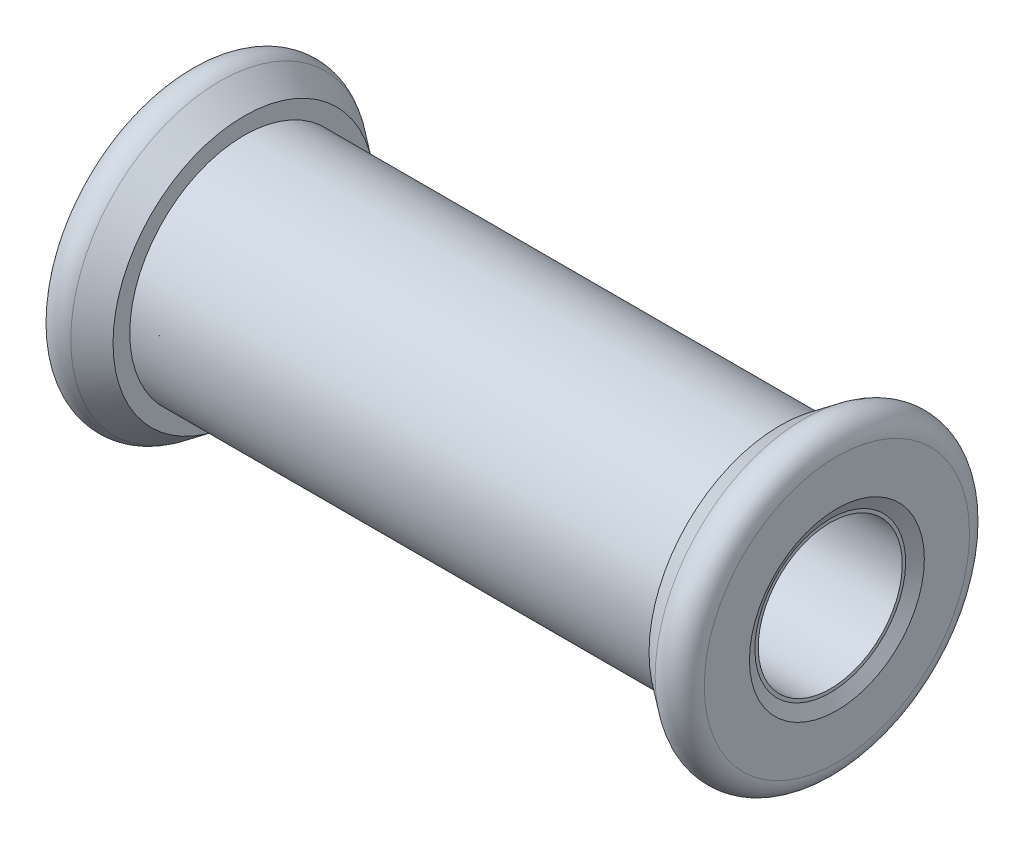
ISO-10303-21;
HEADER;
FILE_DESCRIPTION(('STEP AP214'),'2;1');
FILE_NAME('part.step','',(''),(''),'','','');
FILE_SCHEMA(('AUTOMOTIVE_DESIGN { 1 0 10303 214 1 1 1 1 }'));
ENDSEC;
DATA;
#1=APPLICATION_CONTEXT('core data for automotive mechanical design processes');
#2=APPLICATION_PROTOCOL_DEFINITION('international standard','automotive_design',2000,#1);
#3=PRODUCT_CONTEXT('',#1,'mechanical');
#4=PRODUCT('Part','Part','',(#3));
#5=PRODUCT_RELATED_PRODUCT_CATEGORY('part','',(#4));
#6=PRODUCT_DEFINITION_FORMATION('','',#4);
#7=PRODUCT_DEFINITION_CONTEXT('part definition',#1,'design');
#8=PRODUCT_DEFINITION('design','',#6,#7);
#9=PRODUCT_DEFINITION_SHAPE('','',#8);
#10=(LENGTH_UNIT() NAMED_UNIT(*) SI_UNIT(.MILLI.,.METRE.));
#11=(NAMED_UNIT(*) PLANE_ANGLE_UNIT() SI_UNIT($,.RADIAN.));
#12=(NAMED_UNIT(*) SI_UNIT($,.STERADIAN.) SOLID_ANGLE_UNIT());
#13=UNCERTAINTY_MEASURE_WITH_UNIT(LENGTH_MEASURE(1.E-05),#10,'distance_accuracy_value','');
#14=(GEOMETRIC_REPRESENTATION_CONTEXT(3) GLOBAL_UNCERTAINTY_ASSIGNED_CONTEXT((#13)) GLOBAL_UNIT_ASSIGNED_CONTEXT((#10,
#11,#12)) REPRESENTATION_CONTEXT('',''));
#15=CARTESIAN_POINT('',(0.,0.,0.));
#16=DIRECTION('',(0.,0.,1.));
#17=DIRECTION('',(1.,0.,0.));
#18=AXIS2_PLACEMENT_3D('',#15,#16,#17);
#19=CARTESIAN_POINT('',(-37.0450236506257,2.25,0.));
#20=DIRECTION('',(-1.,0.,0.));
#21=DIRECTION('',(0.,-1.,0.));
#22=AXIS2_PLACEMENT_3D('',#19,#20,#21);
#23=PLANE('',#22);
#24=CARTESIAN_POINT('',(-37.0450236506257,0.,0.));
#25=DIRECTION('',(-1.,0.,0.));
#26=DIRECTION('',(0.,-1.,0.));
#27=AXIS2_PLACEMENT_3D('',#24,#25,#26);
#28=CIRCLE('',#27,2.15);
#29=CARTESIAN_POINT('',(-37.0450236506257,-2.15000000000001,0.));
#30=VERTEX_POINT('',#29);
#31=EDGE_CURVE('E80',#30,#30,#28,.T.);
#32=ORIENTED_EDGE('',*,*,#31,.F.);
#33=EDGE_LOOP('',(#32));
#34=FACE_BOUND('',#33,.T.);
#35=CARTESIAN_POINT('',(-37.0450236506257,0.,0.));
#36=DIRECTION('',(1.,0.,0.));
#37=DIRECTION('',(0.,1.,0.));
#38=AXIS2_PLACEMENT_3D('',#35,#36,#37);
#39=CIRCLE('',#38,2.25);
#40=CARTESIAN_POINT('',(-37.0450236506257,2.25,0.));
#41=VERTEX_POINT('',#40);
#42=EDGE_CURVE('E10',#41,#41,#39,.T.);
#43=ORIENTED_EDGE('',*,*,#42,.F.);
#44=EDGE_LOOP('',(#43));
#45=FACE_BOUND('',#44,.T.);
#46=ADVANCED_FACE('F37',(#34,#45),#23,.T.);
#47=CARTESIAN_POINT('',(-37.2434719696285,0.,0.));
#48=DIRECTION('',(-1.,0.,0.));
#49=DIRECTION('',(0.,-1.,0.));
#50=AXIS2_PLACEMENT_3D('',#47,#48,#49);
#51=CONICAL_SURFACE('',#50,2.61038394250595,1.06744803558932);
#52=ORIENTED_EDGE('',*,*,#42,.T.);
#53=EDGE_LOOP('',(#52));
#54=FACE_BOUND('',#53,.T.);
#55=CARTESIAN_POINT('',(-37.2434719696285,0.,0.));
#56=DIRECTION('',(1.,0.,0.));
#57=DIRECTION('',(0.,1.,0.));
#58=AXIS2_PLACEMENT_3D('',#55,#56,#57);
#59=CIRCLE('',#58,2.61038394250595);
#60=CARTESIAN_POINT('',(-37.2434719696285,2.61038394250594,0.));
#61=VERTEX_POINT('',#60);
#62=EDGE_CURVE('E43',#61,#61,#59,.T.);
#63=ORIENTED_EDGE('',*,*,#62,.F.);
#64=EDGE_LOOP('',(#63));
#65=FACE_BOUND('',#64,.T.);
#66=ADVANCED_FACE('F107',(#54,#65),#51,.F.);
#67=CARTESIAN_POINT('',(-37.2434719696285,3.95960007812495,0.));
#68=DIRECTION('',(-1.,0.,0.));
#69=DIRECTION('',(0.,-1.,0.));
#70=AXIS2_PLACEMENT_3D('',#67,#68,#69);
#71=PLANE('',#70);
#72=ORIENTED_EDGE('',*,*,#62,.T.);
#73=EDGE_LOOP('',(#72));
#74=FACE_BOUND('',#73,.T.);
#75=CARTESIAN_POINT('',(-37.2434719696286,0.,0.));
#76=DIRECTION('',(1.,0.,0.));
#77=DIRECTION('',(0.,1.,0.));
#78=AXIS2_PLACEMENT_3D('',#75,#76,#77);
#79=CIRCLE('',#78,3.95960007812495);
#80=CARTESIAN_POINT('',(-37.2434719696286,3.95960007812495,0.));
#81=VERTEX_POINT('',#80);
#82=EDGE_CURVE('E47',#81,#81,#79,.T.);
#83=ORIENTED_EDGE('',*,*,#82,.F.);
#84=EDGE_LOOP('',(#83));
#85=FACE_BOUND('',#84,.T.);
#86=ADVANCED_FACE('F112',(#74,#85),#71,.T.);
#87=CARTESIAN_POINT('',(-36.632544393478,0.,0.));
#88=DIRECTION('',(1.,0.,0.));
#89=DIRECTION('',(0.,1.,0.));
#90=AXIS2_PLACEMENT_3D('',#87,#88,#89);
#91=TOROIDAL_SURFACE('',#90,3.95960007812495,0.610927576150531);
#92=ORIENTED_EDGE('',*,*,#82,.T.);
#93=EDGE_LOOP('',(#92));
#94=FACE_BOUND('',#93,.T.);
#95=CARTESIAN_POINT('',(-36.2670225791745,0.,0.));
#96=DIRECTION('',(1.,0.,0.));
#97=DIRECTION('',(0.,1.,0.));
#98=AXIS2_PLACEMENT_3D('',#95,#96,#97);
#99=CIRCLE('',#98,4.44911647884042);
#100=CARTESIAN_POINT('',(-36.2670225791745,4.44911647884041,0.));
#101=VERTEX_POINT('',#100);
#102=EDGE_CURVE('E51',#101,#101,#99,.T.);
#103=ORIENTED_EDGE('',*,*,#102,.F.);
#104=EDGE_LOOP('',(#103));
#105=FACE_BOUND('',#104,.T.);
#106=ADVANCED_FACE('F198',(#94,#105),#91,.T.);
#107=CARTESIAN_POINT('',(-35.5450236506257,0.,0.));
#108=DIRECTION('',(-1.,0.,0.));
#109=DIRECTION('',(0.,-1.,0.));
#110=AXIS2_PLACEMENT_3D('',#107,#108,#109);
#111=CONICAL_SURFACE('',#110,3.91000000000001,0.641385653539909);
#112=ORIENTED_EDGE('',*,*,#102,.T.);
#113=EDGE_LOOP('',(#112));
#114=FACE_BOUND('',#113,.T.);
#115=CARTESIAN_POINT('',(-35.5450236506257,0.,0.));
#116=DIRECTION('',(1.,0.,0.));
#117=DIRECTION('',(0.,1.,0.));
#118=AXIS2_PLACEMENT_3D('',#115,#116,#117);
#119=CIRCLE('',#118,3.91000000000001);
#120=CARTESIAN_POINT('',(-35.5450236506257,3.91,0.));
#121=VERTEX_POINT('',#120);
#122=EDGE_CURVE('E56',#121,#121,#119,.T.);
#123=ORIENTED_EDGE('',*,*,#122,.F.);
#124=EDGE_LOOP('',(#123));
#125=FACE_BOUND('',#124,.T.);
#126=ADVANCED_FACE('F188',(#114,#125),#111,.T.);
#127=CARTESIAN_POINT('',(-35.5450236506257,3.41,0.));
#128=DIRECTION('',(1.,0.,0.));
#129=DIRECTION('',(0.,1.,0.));
#130=AXIS2_PLACEMENT_3D('',#127,#128,#129);
#131=PLANE('',#130);
#132=ORIENTED_EDGE('',*,*,#122,.T.);
#133=EDGE_LOOP('',(#132));
#134=FACE_BOUND('',#133,.T.);
#135=CARTESIAN_POINT('',(-35.5450236506257,0.,0.));
#136=DIRECTION('',(1.,0.,0.));
#137=DIRECTION('',(0.,1.,0.));
#138=AXIS2_PLACEMENT_3D('',#135,#136,#137);
#139=CIRCLE('',#138,3.41);
#140=CARTESIAN_POINT('',(-35.5450236506257,3.41,0.));
#141=VERTEX_POINT('',#140);
#142=EDGE_CURVE('E59',#141,#141,#139,.T.);
#143=ORIENTED_EDGE('',*,*,#142,.F.);
#144=EDGE_LOOP('',(#143));
#145=FACE_BOUND('',#144,.T.);
#146=ADVANCED_FACE('F178',(#134,#145),#131,.T.);
#147=CARTESIAN_POINT('',(-9.25051990194016,0.,0.));
#148=DIRECTION('',(1.,0.,0.));
#149=DIRECTION('',(0.,1.,0.));
#150=AXIS2_PLACEMENT_3D('',#147,#148,#149);
#151=CYLINDRICAL_SURFACE('',#150,3.41);
#152=ORIENTED_EDGE('',*,*,#142,.T.);
#153=EDGE_LOOP('',(#152));
#154=FACE_BOUND('',#153,.T.);
#155=CARTESIAN_POINT('',(-19.5450236506257,0.,0.));
#156=DIRECTION('',(1.,0.,0.));
#157=DIRECTION('',(0.,1.,0.));
#158=AXIS2_PLACEMENT_3D('',#155,#156,#157);
#159=CIRCLE('',#158,3.41);
#160=CARTESIAN_POINT('',(-19.5450236506257,3.41,0.));
#161=VERTEX_POINT('',#160);
#162=EDGE_CURVE('E62',#161,#161,#159,.T.);
#163=ORIENTED_EDGE('',*,*,#162,.F.);
#164=EDGE_LOOP('',(#163));
#165=FACE_BOUND('',#164,.T.);
#166=ADVANCED_FACE('F168',(#154,#165),#151,.T.);
#167=CARTESIAN_POINT('',(-19.5450236506257,3.41,0.));
#168=DIRECTION('',(-1.,0.,0.));
#169=DIRECTION('',(0.,-1.,0.));
#170=AXIS2_PLACEMENT_3D('',#167,#168,#169);
#171=PLANE('',#170);
#172=ORIENTED_EDGE('',*,*,#162,.T.);
#173=EDGE_LOOP('',(#172));
#174=FACE_BOUND('',#173,.T.);
#175=CARTESIAN_POINT('',(-19.5450236506257,0.,0.));
#176=DIRECTION('',(1.,0.,0.));
#177=DIRECTION('',(0.,1.,0.));
#178=AXIS2_PLACEMENT_3D('',#175,#176,#177);
#179=CIRCLE('',#178,3.91);
#180=CARTESIAN_POINT('',(-19.5450236506257,3.91,0.));
#181=VERTEX_POINT('',#180);
#182=EDGE_CURVE('E65',#181,#181,#179,.T.);
#183=ORIENTED_EDGE('',*,*,#182,.F.);
#184=EDGE_LOOP('',(#183));
#185=FACE_BOUND('',#184,.T.);
#186=ADVANCED_FACE('F158',(#174,#185),#171,.T.);
#187=CARTESIAN_POINT('',(-18.8230247220769,0.,0.));
#188=DIRECTION('',(1.,0.,0.));
#189=DIRECTION('',(0.,1.,0.));
#190=AXIS2_PLACEMENT_3D('',#187,#188,#189);
#191=CONICAL_SURFACE('',#190,4.44911647884041,0.64138565353991);
#192=ORIENTED_EDGE('',*,*,#182,.T.);
#193=EDGE_LOOP('',(#192));
#194=FACE_BOUND('',#193,.T.);
#195=CARTESIAN_POINT('',(-18.8230247220769,0.,0.));
#196=DIRECTION('',(1.,0.,0.));
#197=DIRECTION('',(0.,1.,0.));
#198=AXIS2_PLACEMENT_3D('',#195,#196,#197);
#199=CIRCLE('',#198,4.44911647884041);
#200=CARTESIAN_POINT('',(-18.8230247220769,4.44911647884041,0.));
#201=VERTEX_POINT('',#200);
#202=EDGE_CURVE('E68',#201,#201,#199,.T.);
#203=ORIENTED_EDGE('',*,*,#202,.F.);
#204=EDGE_LOOP('',(#203));
#205=FACE_BOUND('',#204,.T.);
#206=ADVANCED_FACE('F148',(#194,#205),#191,.T.);
#207=CARTESIAN_POINT('',(-18.4575029077734,0.,0.));
#208=DIRECTION('',(1.,0.,0.));
#209=DIRECTION('',(0.,1.,0.));
#210=AXIS2_PLACEMENT_3D('',#207,#208,#209);
#211=TOROIDAL_SURFACE('',#210,3.95960007812495,0.610927576150534);
#212=ORIENTED_EDGE('',*,*,#202,.T.);
#213=EDGE_LOOP('',(#212));
#214=FACE_BOUND('',#213,.T.);
#215=CARTESIAN_POINT('',(-17.8465753316229,0.,0.));
#216=DIRECTION('',(1.,0.,0.));
#217=DIRECTION('',(0.,1.,0.));
#218=AXIS2_PLACEMENT_3D('',#215,#216,#217);
#219=CIRCLE('',#218,3.95960007812495);
#220=CARTESIAN_POINT('',(-17.8465753316229,3.95960007812495,0.));
#221=VERTEX_POINT('',#220);
#222=EDGE_CURVE('E71',#221,#221,#219,.T.);
#223=ORIENTED_EDGE('',*,*,#222,.F.);
#224=EDGE_LOOP('',(#223));
#225=FACE_BOUND('',#224,.T.);
#226=ADVANCED_FACE('F103',(#214,#225),#211,.T.);
#227=CARTESIAN_POINT('',(-17.8465753316229,3.95960007812495,0.));
#228=DIRECTION('',(1.,0.,0.));
#229=DIRECTION('',(0.,1.,0.));
#230=AXIS2_PLACEMENT_3D('',#227,#228,#229);
#231=PLANE('',#230);
#232=ORIENTED_EDGE('',*,*,#222,.T.);
#233=EDGE_LOOP('',(#232));
#234=FACE_BOUND('',#233,.T.);
#235=CARTESIAN_POINT('',(-17.8465753316229,0.,0.));
#236=DIRECTION('',(1.,0.,0.));
#237=DIRECTION('',(0.,1.,0.));
#238=AXIS2_PLACEMENT_3D('',#235,#236,#237);
#239=CIRCLE('',#238,2.61038394250595);
#240=CARTESIAN_POINT('',(-17.8465753316229,2.61038394250594,0.));
#241=VERTEX_POINT('',#240);
#242=EDGE_CURVE('E74',#241,#241,#239,.T.);
#243=ORIENTED_EDGE('',*,*,#242,.F.);
#244=EDGE_LOOP('',(#243));
#245=FACE_BOUND('',#244,.T.);
#246=ADVANCED_FACE('F97',(#234,#245),#231,.T.);
#247=CARTESIAN_POINT('',(-18.0450236506257,0.,0.));
#248=DIRECTION('',(1.,0.,0.));
#249=DIRECTION('',(0.,1.,0.));
#250=AXIS2_PLACEMENT_3D('',#247,#248,#249);
#251=CONICAL_SURFACE('',#250,2.25,1.06744803558932);
#252=ORIENTED_EDGE('',*,*,#242,.T.);
#253=EDGE_LOOP('',(#252));
#254=FACE_BOUND('',#253,.T.);
#255=CARTESIAN_POINT('',(-18.0450236506257,0.,0.));
#256=DIRECTION('',(1.,0.,0.));
#257=DIRECTION('',(0.,1.,0.));
#258=AXIS2_PLACEMENT_3D('',#255,#256,#257);
#259=CIRCLE('',#258,2.25);
#260=CARTESIAN_POINT('',(-18.0450236506257,2.25,0.));
#261=VERTEX_POINT('',#260);
#262=EDGE_CURVE('E77',#261,#261,#259,.T.);
#263=ORIENTED_EDGE('',*,*,#262,.F.);
#264=EDGE_LOOP('',(#263));
#265=FACE_BOUND('',#264,.T.);
#266=ADVANCED_FACE('F92',(#254,#265),#251,.F.);
#267=CARTESIAN_POINT('',(-18.0450236506257,2.25,0.));
#268=DIRECTION('',(1.,0.,0.));
#269=DIRECTION('',(0.,1.,0.));
#270=AXIS2_PLACEMENT_3D('',#267,#268,#269);
#271=PLANE('',#270);
#272=CARTESIAN_POINT('',(-18.0450236506257,0.,0.));
#273=DIRECTION('',(1.,0.,0.));
#274=DIRECTION('',(0.,1.,0.));
#275=AXIS2_PLACEMENT_3D('',#272,#273,#274);
#276=CIRCLE('',#275,2.15);
#277=CARTESIAN_POINT('',(-18.0450236506257,2.15,0.));
#278=VERTEX_POINT('',#277);
#279=EDGE_CURVE('E83',#278,#278,#276,.T.);
#280=ORIENTED_EDGE('',*,*,#279,.F.);
#281=EDGE_LOOP('',(#280));
#282=FACE_BOUND('',#281,.T.);
#283=ORIENTED_EDGE('',*,*,#262,.T.);
#284=EDGE_LOOP('',(#283));
#285=FACE_BOUND('',#284,.T.);
#286=ADVANCED_FACE('F89',(#282,#285),#271,.T.);
#287=CARTESIAN_POINT('',(-46.0450236506257,0.,0.));
#288=DIRECTION('',(1.,0.,0.));
#289=DIRECTION('',(0.,1.,0.));
#290=AXIS2_PLACEMENT_3D('',#287,#288,#289);
#291=CYLINDRICAL_SURFACE('',#290,2.15);
#292=ORIENTED_EDGE('',*,*,#31,.T.);
#293=EDGE_LOOP('',(#292));
#294=FACE_BOUND('',#293,.T.);
#295=ORIENTED_EDGE('',*,*,#279,.T.);
#296=EDGE_LOOP('',(#295));
#297=FACE_BOUND('',#296,.T.);
#298=ADVANCED_FACE('F87',(#294,#297),#291,.F.);
#299=CLOSED_SHELL('',(#46,#66,#86,#106,#126,#146,#166,#186,#206,#226,#246,#266,#286,#298));
#300=MANIFOLD_SOLID_BREP('B2',#299);
#301=ADVANCED_BREP_SHAPE_REPRESENTATION('',(#18,#300),#14);
#302=SHAPE_DEFINITION_REPRESENTATION(#9,#301);
ENDSEC;
END-ISO-10303-21;
